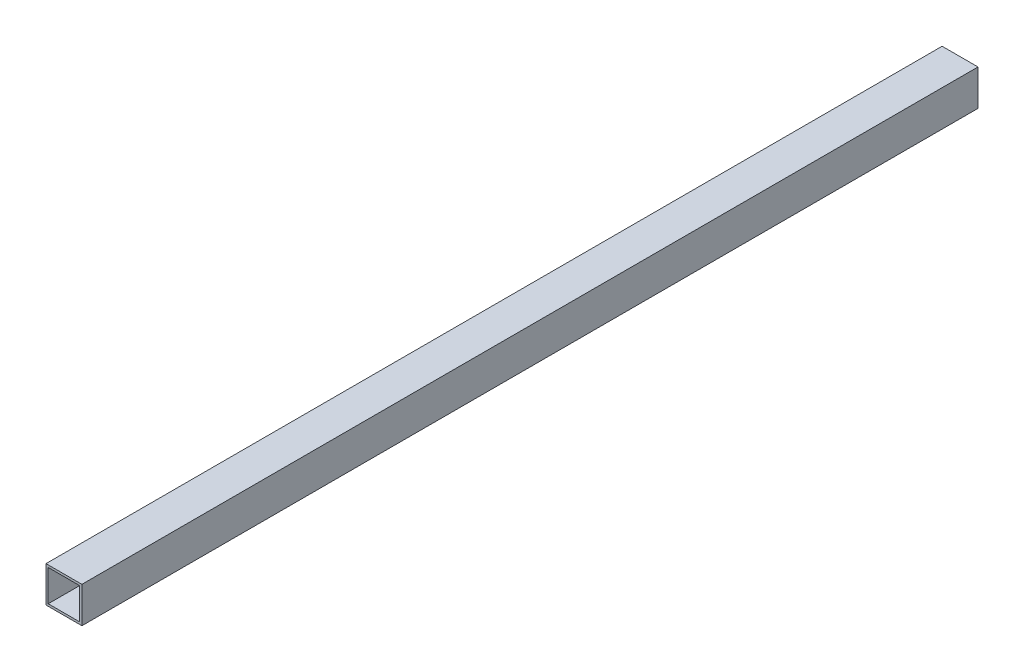
ISO-10303-21;
HEADER;
FILE_DESCRIPTION(('STEP AP214'),'2;1');
FILE_NAME('part.step','',(''),(''),'','','');
FILE_SCHEMA(('AUTOMOTIVE_DESIGN { 1 0 10303 214 1 1 1 1 }'));
ENDSEC;
DATA;
#1=APPLICATION_CONTEXT('core data for automotive mechanical design processes');
#2=APPLICATION_PROTOCOL_DEFINITION('international standard','automotive_design',2000,#1);
#3=PRODUCT_CONTEXT('',#1,'mechanical');
#4=PRODUCT('Part','Part','',(#3));
#5=PRODUCT_RELATED_PRODUCT_CATEGORY('part','',(#4));
#6=PRODUCT_DEFINITION_FORMATION('','',#4);
#7=PRODUCT_DEFINITION_CONTEXT('part definition',#1,'design');
#8=PRODUCT_DEFINITION('design','',#6,#7);
#9=PRODUCT_DEFINITION_SHAPE('','',#8);
#10=(LENGTH_UNIT() NAMED_UNIT(*) SI_UNIT(.MILLI.,.METRE.));
#11=(NAMED_UNIT(*) PLANE_ANGLE_UNIT() SI_UNIT($,.RADIAN.));
#12=(NAMED_UNIT(*) SI_UNIT($,.STERADIAN.) SOLID_ANGLE_UNIT());
#13=UNCERTAINTY_MEASURE_WITH_UNIT(LENGTH_MEASURE(1.E-05),#10,'distance_accuracy_value','');
#14=(GEOMETRIC_REPRESENTATION_CONTEXT(3) GLOBAL_UNCERTAINTY_ASSIGNED_CONTEXT((#13)) GLOBAL_UNIT_ASSIGNED_CONTEXT((#10,
#11,#12)) REPRESENTATION_CONTEXT('',''));
#15=CARTESIAN_POINT('',(0.,0.,0.));
#16=DIRECTION('',(0.,0.,1.));
#17=DIRECTION('',(1.,0.,0.));
#18=AXIS2_PLACEMENT_3D('',#15,#16,#17);
#19=CARTESIAN_POINT('',(0.,0.,1902.4));
#20=DIRECTION('',(0.,0.,1.));
#21=DIRECTION('',(1.,0.,0.));
#22=AXIS2_PLACEMENT_3D('',#19,#20,#21);
#23=PLANE('',#22);
#24=DIRECTION('',(0.,-1.,0.));
#25=VECTOR('',#24,1.);
#26=CARTESIAN_POINT('',(0.,0.,1902.4));
#27=LINE('',#26,#25);
#28=CARTESIAN_POINT('',(0.,0.,1902.4));
#29=VERTEX_POINT('',#28);
#30=CARTESIAN_POINT('',(0.,-76.2,1902.4));
#31=VERTEX_POINT('',#30);
#32=EDGE_CURVE('E136',#29,#31,#27,.T.);
#33=ORIENTED_EDGE('',*,*,#32,.T.);
#34=DIRECTION('',(1.,0.,0.));
#35=VECTOR('',#34,1.);
#36=CARTESIAN_POINT('',(0.,-76.2,1902.4));
#37=LINE('',#36,#35);
#38=CARTESIAN_POINT('',(76.2,-76.2,1902.4));
#39=VERTEX_POINT('',#38);
#40=EDGE_CURVE('E139',#31,#39,#37,.T.);
#41=ORIENTED_EDGE('',*,*,#40,.T.);
#42=DIRECTION('',(0.,1.,0.));
#43=VECTOR('',#42,1.);
#44=CARTESIAN_POINT('',(76.2,0.,1902.4));
#45=LINE('',#44,#43);
#46=CARTESIAN_POINT('',(76.2,0.,1902.4));
#47=VERTEX_POINT('',#46);
#48=EDGE_CURVE('E142',#39,#47,#45,.T.);
#49=ORIENTED_EDGE('',*,*,#48,.T.);
#50=DIRECTION('',(-1.,0.,0.));
#51=VECTOR('',#50,1.);
#52=CARTESIAN_POINT('',(0.,0.,1902.4));
#53=LINE('',#52,#51);
#54=EDGE_CURVE('E144',#47,#29,#53,.T.);
#55=ORIENTED_EDGE('',*,*,#54,.T.);
#56=EDGE_LOOP('',(#33,#41,#49,#55));
#57=FACE_BOUND('',#56,.T.);
#58=DIRECTION('',(1.,0.,0.));
#59=VECTOR('',#58,1.);
#60=CARTESIAN_POINT('',(4.7625,-71.4375,1902.4));
#61=LINE('',#60,#59);
#62=CARTESIAN_POINT('',(4.7625,-71.4375,1902.4));
#63=VERTEX_POINT('',#62);
#64=CARTESIAN_POINT('',(71.4375,-71.4375,1902.4));
#65=VERTEX_POINT('',#64);
#66=EDGE_CURVE('E108',#63,#65,#61,.T.);
#67=ORIENTED_EDGE('',*,*,#66,.F.);
#68=DIRECTION('',(0.,-1.,0.));
#69=VECTOR('',#68,1.);
#70=CARTESIAN_POINT('',(4.7625,-4.7625,1902.4));
#71=LINE('',#70,#69);
#72=CARTESIAN_POINT('',(4.7625,-4.7625,1902.4));
#73=VERTEX_POINT('',#72);
#74=EDGE_CURVE('E100',#73,#63,#71,.T.);
#75=ORIENTED_EDGE('',*,*,#74,.F.);
#76=DIRECTION('',(-1.,0.,0.));
#77=VECTOR('',#76,1.);
#78=CARTESIAN_POINT('',(4.7625,-4.7625,1902.4));
#79=LINE('',#78,#77);
#80=CARTESIAN_POINT('',(71.4375,-4.7625,1902.4));
#81=VERTEX_POINT('',#80);
#82=EDGE_CURVE('E122',#81,#73,#79,.T.);
#83=ORIENTED_EDGE('',*,*,#82,.F.);
#84=DIRECTION('',(0.,1.,0.));
#85=VECTOR('',#84,1.);
#86=CARTESIAN_POINT('',(71.4375,-4.7625,1902.4));
#87=LINE('',#86,#85);
#88=EDGE_CURVE('E120',#65,#81,#87,.T.);
#89=ORIENTED_EDGE('',*,*,#88,.F.);
#90=EDGE_LOOP('',(#67,#75,#83,#89));
#91=FACE_BOUND('',#90,.T.);
#92=ADVANCED_FACE('F35',(#57,#91),#23,.T.);
#93=CARTESIAN_POINT('',(0.,0.,0.));
#94=DIRECTION('',(0.,0.,1.));
#95=DIRECTION('',(1.,0.,0.));
#96=AXIS2_PLACEMENT_3D('',#93,#94,#95);
#97=PLANE('',#96);
#98=DIRECTION('',(0.,-1.,0.));
#99=VECTOR('',#98,1.);
#100=CARTESIAN_POINT('',(0.,0.,0.));
#101=LINE('',#100,#99);
#102=CARTESIAN_POINT('',(0.,0.,0.));
#103=VERTEX_POINT('',#102);
#104=CARTESIAN_POINT('',(0.,-76.2,0.));
#105=VERTEX_POINT('',#104);
#106=EDGE_CURVE('E116',#103,#105,#101,.T.);
#107=ORIENTED_EDGE('',*,*,#106,.F.);
#108=DIRECTION('',(-1.,0.,0.));
#109=VECTOR('',#108,1.);
#110=CARTESIAN_POINT('',(0.,0.,0.));
#111=LINE('',#110,#109);
#112=CARTESIAN_POINT('',(76.2,0.,0.));
#113=VERTEX_POINT('',#112);
#114=EDGE_CURVE('E140',#113,#103,#111,.T.);
#115=ORIENTED_EDGE('',*,*,#114,.F.);
#116=DIRECTION('',(0.,1.,0.));
#117=VECTOR('',#116,1.);
#118=CARTESIAN_POINT('',(76.2,0.,0.));
#119=LINE('',#118,#117);
#120=CARTESIAN_POINT('',(76.2,-76.2,0.));
#121=VERTEX_POINT('',#120);
#122=EDGE_CURVE('E151',#121,#113,#119,.T.);
#123=ORIENTED_EDGE('',*,*,#122,.F.);
#124=DIRECTION('',(1.,0.,0.));
#125=VECTOR('',#124,1.);
#126=CARTESIAN_POINT('',(0.,-76.2,0.));
#127=LINE('',#126,#125);
#128=EDGE_CURVE('E149',#105,#121,#127,.T.);
#129=ORIENTED_EDGE('',*,*,#128,.F.);
#130=EDGE_LOOP('',(#107,#115,#123,#129));
#131=FACE_BOUND('',#130,.T.);
#132=DIRECTION('',(0.,-1.,0.));
#133=VECTOR('',#132,1.);
#134=CARTESIAN_POINT('',(4.7625,-4.7625,0.));
#135=LINE('',#134,#133);
#136=CARTESIAN_POINT('',(4.7625,-4.7625,0.));
#137=VERTEX_POINT('',#136);
#138=CARTESIAN_POINT('',(4.7625,-71.4375,0.));
#139=VERTEX_POINT('',#138);
#140=EDGE_CURVE('E58',#137,#139,#135,.T.);
#141=ORIENTED_EDGE('',*,*,#140,.T.);
#142=DIRECTION('',(1.,0.,0.));
#143=VECTOR('',#142,1.);
#144=CARTESIAN_POINT('',(4.7625,-71.4375,0.));
#145=LINE('',#144,#143);
#146=CARTESIAN_POINT('',(71.4375,-71.4375,0.));
#147=VERTEX_POINT('',#146);
#148=EDGE_CURVE('E115',#139,#147,#145,.T.);
#149=ORIENTED_EDGE('',*,*,#148,.T.);
#150=DIRECTION('',(0.,1.,0.));
#151=VECTOR('',#150,1.);
#152=CARTESIAN_POINT('',(71.4375,-4.7625,0.));
#153=LINE('',#152,#151);
#154=CARTESIAN_POINT('',(71.4375,-4.7625,0.));
#155=VERTEX_POINT('',#154);
#156=EDGE_CURVE('E128',#147,#155,#153,.T.);
#157=ORIENTED_EDGE('',*,*,#156,.T.);
#158=DIRECTION('',(-1.,0.,0.));
#159=VECTOR('',#158,1.);
#160=CARTESIAN_POINT('',(4.7625,-4.7625,0.));
#161=LINE('',#160,#159);
#162=EDGE_CURVE('E109',#155,#137,#161,.T.);
#163=ORIENTED_EDGE('',*,*,#162,.T.);
#164=EDGE_LOOP('',(#141,#149,#157,#163));
#165=FACE_BOUND('',#164,.T.);
#166=ADVANCED_FACE('F169',(#131,#165),#97,.F.);
#167=CARTESIAN_POINT('',(0.,0.,1902.4));
#168=DIRECTION('',(1.,0.,0.));
#169=DIRECTION('',(0.,1.,0.));
#170=AXIS2_PLACEMENT_3D('',#167,#168,#169);
#171=PLANE('',#170);
#172=ORIENTED_EDGE('',*,*,#106,.T.);
#173=DIRECTION('',(0.,0.,-1.));
#174=VECTOR('',#173,1.);
#175=CARTESIAN_POINT('',(0.,-76.2,1902.4));
#176=LINE('',#175,#174);
#177=EDGE_CURVE('E11',#31,#105,#176,.T.);
#178=ORIENTED_EDGE('',*,*,#177,.F.);
#179=ORIENTED_EDGE('',*,*,#32,.F.);
#180=DIRECTION('',(0.,0.,-1.));
#181=VECTOR('',#180,1.);
#182=CARTESIAN_POINT('',(0.,0.,1902.4));
#183=LINE('',#182,#181);
#184=EDGE_CURVE('E146',#29,#103,#183,.T.);
#185=ORIENTED_EDGE('',*,*,#184,.T.);
#186=EDGE_LOOP('',(#172,#178,#179,#185));
#187=FACE_BOUND('',#186,.T.);
#188=ADVANCED_FACE('F37',(#187),#171,.F.);
#189=CARTESIAN_POINT('',(0.,-76.2,1902.4));
#190=DIRECTION('',(0.,1.,0.));
#191=DIRECTION('',(0.,0.,1.));
#192=AXIS2_PLACEMENT_3D('',#189,#190,#191);
#193=PLANE('',#192);
#194=ORIENTED_EDGE('',*,*,#128,.T.);
#195=DIRECTION('',(0.,0.,-1.));
#196=VECTOR('',#195,1.);
#197=CARTESIAN_POINT('',(76.2,-76.2,1902.4));
#198=LINE('',#197,#196);
#199=EDGE_CURVE('E43',#39,#121,#198,.T.);
#200=ORIENTED_EDGE('',*,*,#199,.F.);
#201=ORIENTED_EDGE('',*,*,#40,.F.);
#202=ORIENTED_EDGE('',*,*,#177,.T.);
#203=EDGE_LOOP('',(#194,#200,#201,#202));
#204=FACE_BOUND('',#203,.T.);
#205=ADVANCED_FACE('F179',(#204),#193,.F.);
#206=CARTESIAN_POINT('',(76.2,0.,1902.4));
#207=DIRECTION('',(-1.,0.,0.));
#208=DIRECTION('',(0.,-1.,0.));
#209=AXIS2_PLACEMENT_3D('',#206,#207,#208);
#210=PLANE('',#209);
#211=ORIENTED_EDGE('',*,*,#122,.T.);
#212=DIRECTION('',(0.,0.,-1.));
#213=VECTOR('',#212,1.);
#214=CARTESIAN_POINT('',(76.2,0.,1902.4));
#215=LINE('',#214,#213);
#216=EDGE_CURVE('E156',#47,#113,#215,.T.);
#217=ORIENTED_EDGE('',*,*,#216,.F.);
#218=ORIENTED_EDGE('',*,*,#48,.F.);
#219=ORIENTED_EDGE('',*,*,#199,.T.);
#220=EDGE_LOOP('',(#211,#217,#218,#219));
#221=FACE_BOUND('',#220,.T.);
#222=ADVANCED_FACE('F163',(#221),#210,.F.);
#223=CARTESIAN_POINT('',(0.,0.,1902.4));
#224=DIRECTION('',(0.,-1.,0.));
#225=DIRECTION('',(0.,0.,-1.));
#226=AXIS2_PLACEMENT_3D('',#223,#224,#225);
#227=PLANE('',#226);
#228=ORIENTED_EDGE('',*,*,#114,.T.);
#229=ORIENTED_EDGE('',*,*,#184,.F.);
#230=ORIENTED_EDGE('',*,*,#54,.F.);
#231=ORIENTED_EDGE('',*,*,#216,.T.);
#232=EDGE_LOOP('',(#228,#229,#230,#231));
#233=FACE_BOUND('',#232,.T.);
#234=ADVANCED_FACE('F173',(#233),#227,.F.);
#235=CARTESIAN_POINT('',(4.7625,-4.7625,1902.4));
#236=DIRECTION('',(1.,0.,0.));
#237=DIRECTION('',(0.,0.,-1.));
#238=AXIS2_PLACEMENT_3D('',#235,#236,#237);
#239=PLANE('',#238);
#240=ORIENTED_EDGE('',*,*,#140,.F.);
#241=DIRECTION('',(0.,0.,-1.));
#242=VECTOR('',#241,1.);
#243=CARTESIAN_POINT('',(4.7625,-4.7625,1902.4));
#244=LINE('',#243,#242);
#245=EDGE_CURVE('E104',#73,#137,#244,.T.);
#246=ORIENTED_EDGE('',*,*,#245,.F.);
#247=ORIENTED_EDGE('',*,*,#74,.T.);
#248=DIRECTION('',(0.,0.,-1.));
#249=VECTOR('',#248,1.);
#250=CARTESIAN_POINT('',(4.7625,-71.4375,1902.4));
#251=LINE('',#250,#249);
#252=EDGE_CURVE('E103',#63,#139,#251,.T.);
#253=ORIENTED_EDGE('',*,*,#252,.T.);
#254=EDGE_LOOP('',(#240,#246,#247,#253));
#255=FACE_BOUND('',#254,.T.);
#256=ADVANCED_FACE('F102',(#255),#239,.T.);
#257=CARTESIAN_POINT('',(4.7625,-71.4375,1902.4));
#258=DIRECTION('',(0.,1.,0.));
#259=DIRECTION('',(0.,0.,1.));
#260=AXIS2_PLACEMENT_3D('',#257,#258,#259);
#261=PLANE('',#260);
#262=ORIENTED_EDGE('',*,*,#148,.F.);
#263=ORIENTED_EDGE('',*,*,#252,.F.);
#264=ORIENTED_EDGE('',*,*,#66,.T.);
#265=DIRECTION('',(0.,0.,-1.));
#266=VECTOR('',#265,1.);
#267=CARTESIAN_POINT('',(71.4375,-71.4375,1902.4));
#268=LINE('',#267,#266);
#269=EDGE_CURVE('E117',#65,#147,#268,.T.);
#270=ORIENTED_EDGE('',*,*,#269,.T.);
#271=EDGE_LOOP('',(#262,#263,#264,#270));
#272=FACE_BOUND('',#271,.T.);
#273=ADVANCED_FACE('F112',(#272),#261,.T.);
#274=CARTESIAN_POINT('',(71.4375,-4.7625,1902.4));
#275=DIRECTION('',(-1.,0.,0.));
#276=DIRECTION('',(0.,0.,1.));
#277=AXIS2_PLACEMENT_3D('',#274,#275,#276);
#278=PLANE('',#277);
#279=ORIENTED_EDGE('',*,*,#156,.F.);
#280=ORIENTED_EDGE('',*,*,#269,.F.);
#281=ORIENTED_EDGE('',*,*,#88,.T.);
#282=DIRECTION('',(0.,0.,-1.));
#283=VECTOR('',#282,1.);
#284=CARTESIAN_POINT('',(71.4375,-4.7625,1902.4));
#285=LINE('',#284,#283);
#286=EDGE_CURVE('E50',#81,#155,#285,.T.);
#287=ORIENTED_EDGE('',*,*,#286,.T.);
#288=EDGE_LOOP('',(#279,#280,#281,#287));
#289=FACE_BOUND('',#288,.T.);
#290=ADVANCED_FACE('F202',(#289),#278,.T.);
#291=CARTESIAN_POINT('',(4.7625,-4.7625,1902.4));
#292=DIRECTION('',(0.,-1.,0.));
#293=DIRECTION('',(0.,0.,-1.));
#294=AXIS2_PLACEMENT_3D('',#291,#292,#293);
#295=PLANE('',#294);
#296=ORIENTED_EDGE('',*,*,#162,.F.);
#297=ORIENTED_EDGE('',*,*,#286,.F.);
#298=ORIENTED_EDGE('',*,*,#82,.T.);
#299=ORIENTED_EDGE('',*,*,#245,.T.);
#300=EDGE_LOOP('',(#296,#297,#298,#299));
#301=FACE_BOUND('',#300,.T.);
#302=ADVANCED_FACE('F206',(#301),#295,.T.);
#303=CLOSED_SHELL('',(#92,#166,#188,#205,#222,#234,#256,#273,#290,#302));
#304=MANIFOLD_SOLID_BREP('B2',#303);
#305=ADVANCED_BREP_SHAPE_REPRESENTATION('',(#18,#304),#14);
#306=SHAPE_DEFINITION_REPRESENTATION(#9,#305);
ENDSEC;
END-ISO-10303-21;
